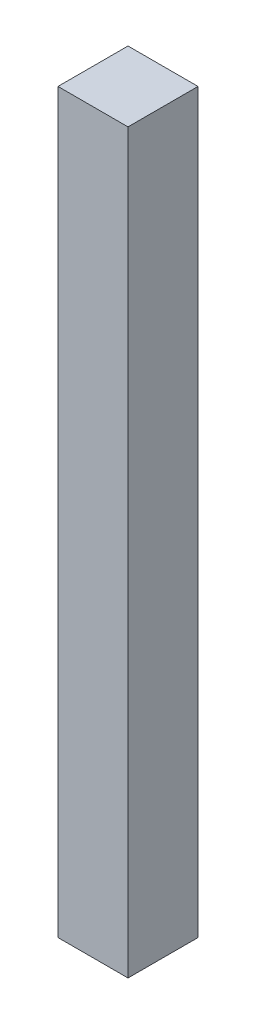
ISO-10303-21;
HEADER;
FILE_DESCRIPTION(('STEP AP214'),'2;1');
FILE_NAME('part.step','',(''),(''),'','','');
FILE_SCHEMA(('AUTOMOTIVE_DESIGN { 1 0 10303 214 1 1 1 1 }'));
ENDSEC;
DATA;
#1=APPLICATION_CONTEXT('core data for automotive mechanical design processes');
#2=APPLICATION_PROTOCOL_DEFINITION('international standard','automotive_design',2000,#1);
#3=PRODUCT_CONTEXT('',#1,'mechanical');
#4=PRODUCT('Part','Part','',(#3));
#5=PRODUCT_RELATED_PRODUCT_CATEGORY('part','',(#4));
#6=PRODUCT_DEFINITION_FORMATION('','',#4);
#7=PRODUCT_DEFINITION_CONTEXT('part definition',#1,'design');
#8=PRODUCT_DEFINITION('design','',#6,#7);
#9=PRODUCT_DEFINITION_SHAPE('','',#8);
#10=(LENGTH_UNIT() NAMED_UNIT(*) SI_UNIT(.MILLI.,.METRE.));
#11=(NAMED_UNIT(*) PLANE_ANGLE_UNIT() SI_UNIT($,.RADIAN.));
#12=(NAMED_UNIT(*) SI_UNIT($,.STERADIAN.) SOLID_ANGLE_UNIT());
#13=UNCERTAINTY_MEASURE_WITH_UNIT(LENGTH_MEASURE(1.E-05),#10,'distance_accuracy_value','');
#14=(GEOMETRIC_REPRESENTATION_CONTEXT(3) GLOBAL_UNCERTAINTY_ASSIGNED_CONTEXT((#13)) GLOBAL_UNIT_ASSIGNED_CONTEXT((#10,
#11,#12)) REPRESENTATION_CONTEXT('',''));
#15=CARTESIAN_POINT('',(0.,0.,0.));
#16=DIRECTION('',(0.,0.,1.));
#17=DIRECTION('',(1.,0.,0.));
#18=AXIS2_PLACEMENT_3D('',#15,#16,#17);
#19=CARTESIAN_POINT('',(-1.68461538461538,60.,-1.89615384615384));
#20=DIRECTION('',(1.,0.,0.));
#21=DIRECTION('',(0.,0.,-1.));
#22=AXIS2_PLACEMENT_3D('',#19,#20,#21);
#23=PLANE('',#22);
#24=DIRECTION('',(0.,0.,1.));
#25=VECTOR('',#24,1.);
#26=CARTESIAN_POINT('',(-1.68461538461538,0.,-1.89615384615384));
#27=LINE('',#26,#25);
#28=CARTESIAN_POINT('',(-1.68461538461538,0.,-1.89615384615384));
#29=VERTEX_POINT('',#28);
#30=CARTESIAN_POINT('',(-1.68461538461537,0.,3.80384615384616));
#31=VERTEX_POINT('',#30);
#32=EDGE_CURVE('E107',#29,#31,#27,.T.);
#33=ORIENTED_EDGE('',*,*,#32,.T.);
#34=DIRECTION('',(0.,-1.,0.));
#35=VECTOR('',#34,1.);
#36=CARTESIAN_POINT('',(-1.68461538461537,60.,3.80384615384616));
#37=LINE('',#36,#35);
#38=CARTESIAN_POINT('',(-1.68461538461537,60.,3.80384615384616));
#39=VERTEX_POINT('',#38);
#40=EDGE_CURVE('E11',#39,#31,#37,.T.);
#41=ORIENTED_EDGE('',*,*,#40,.F.);
#42=DIRECTION('',(0.,0.,1.));
#43=VECTOR('',#42,1.);
#44=CARTESIAN_POINT('',(-1.68461538461538,60.,-1.89615384615384));
#45=LINE('',#44,#43);
#46=CARTESIAN_POINT('',(-1.68461538461538,60.,-1.89615384615384));
#47=VERTEX_POINT('',#46);
#48=EDGE_CURVE('E91',#47,#39,#45,.T.);
#49=ORIENTED_EDGE('',*,*,#48,.F.);
#50=DIRECTION('',(0.,-1.,0.));
#51=VECTOR('',#50,1.);
#52=CARTESIAN_POINT('',(-1.68461538461538,60.,-1.89615384615384));
#53=LINE('',#52,#51);
#54=EDGE_CURVE('E103',#47,#29,#53,.T.);
#55=ORIENTED_EDGE('',*,*,#54,.T.);
#56=EDGE_LOOP('',(#33,#41,#49,#55));
#57=FACE_BOUND('',#56,.T.);
#58=ADVANCED_FACE('F39',(#57),#23,.F.);
#59=CARTESIAN_POINT('',(-1.68461538461537,60.,3.80384615384616));
#60=DIRECTION('',(0.,0.,-1.));
#61=DIRECTION('',(-1.,0.,0.));
#62=AXIS2_PLACEMENT_3D('',#59,#60,#61);
#63=PLANE('',#62);
#64=DIRECTION('',(1.,0.,0.));
#65=VECTOR('',#64,1.);
#66=CARTESIAN_POINT('',(-1.68461538461537,0.,3.80384615384616));
#67=LINE('',#66,#65);
#68=CARTESIAN_POINT('',(4.01538461538463,0.,3.80384615384616));
#69=VERTEX_POINT('',#68);
#70=EDGE_CURVE('E96',#31,#69,#67,.T.);
#71=ORIENTED_EDGE('',*,*,#70,.T.);
#72=DIRECTION('',(0.,-1.,0.));
#73=VECTOR('',#72,1.);
#74=CARTESIAN_POINT('',(4.01538461538463,60.,3.80384615384616));
#75=LINE('',#74,#73);
#76=CARTESIAN_POINT('',(4.01538461538463,60.,3.80384615384616));
#77=VERTEX_POINT('',#76);
#78=EDGE_CURVE('E48',#77,#69,#75,.T.);
#79=ORIENTED_EDGE('',*,*,#78,.F.);
#80=DIRECTION('',(1.,0.,0.));
#81=VECTOR('',#80,1.);
#82=CARTESIAN_POINT('',(-1.68461538461537,60.,3.80384615384616));
#83=LINE('',#82,#81);
#84=EDGE_CURVE('E86',#39,#77,#83,.T.);
#85=ORIENTED_EDGE('',*,*,#84,.F.);
#86=ORIENTED_EDGE('',*,*,#40,.T.);
#87=EDGE_LOOP('',(#71,#79,#85,#86));
#88=FACE_BOUND('',#87,.T.);
#89=ADVANCED_FACE('F95',(#88),#63,.F.);
#90=CARTESIAN_POINT('',(4.01538461538462,60.,-1.89615384615384));
#91=DIRECTION('',(-1.,0.,0.));
#92=DIRECTION('',(0.,0.,1.));
#93=AXIS2_PLACEMENT_3D('',#90,#91,#92);
#94=PLANE('',#93);
#95=DIRECTION('',(0.,0.,-1.));
#96=VECTOR('',#95,1.);
#97=CARTESIAN_POINT('',(4.01538461538462,0.,-1.89615384615384));
#98=LINE('',#97,#96);
#99=CARTESIAN_POINT('',(4.01538461538462,0.,-1.89615384615384));
#100=VERTEX_POINT('',#99);
#101=EDGE_CURVE('E73',#69,#100,#98,.T.);
#102=ORIENTED_EDGE('',*,*,#101,.T.);
#103=DIRECTION('',(0.,-1.,0.));
#104=VECTOR('',#103,1.);
#105=CARTESIAN_POINT('',(4.01538461538462,60.,-1.89615384615384));
#106=LINE('',#105,#104);
#107=CARTESIAN_POINT('',(4.01538461538462,60.,-1.89615384615384));
#108=VERTEX_POINT('',#107);
#109=EDGE_CURVE('E98',#108,#100,#106,.T.);
#110=ORIENTED_EDGE('',*,*,#109,.F.);
#111=DIRECTION('',(0.,0.,-1.));
#112=VECTOR('',#111,1.);
#113=CARTESIAN_POINT('',(4.01538461538462,60.,-1.89615384615384));
#114=LINE('',#113,#112);
#115=EDGE_CURVE('E89',#77,#108,#114,.T.);
#116=ORIENTED_EDGE('',*,*,#115,.F.);
#117=ORIENTED_EDGE('',*,*,#78,.T.);
#118=EDGE_LOOP('',(#102,#110,#116,#117));
#119=FACE_BOUND('',#118,.T.);
#120=ADVANCED_FACE('F99',(#119),#94,.F.);
#121=CARTESIAN_POINT('',(-1.68461538461538,60.,-1.89615384615384));
#122=DIRECTION('',(0.,0.,1.));
#123=DIRECTION('',(1.,0.,0.));
#124=AXIS2_PLACEMENT_3D('',#121,#122,#123);
#125=PLANE('',#124);
#126=DIRECTION('',(-1.,0.,0.));
#127=VECTOR('',#126,1.);
#128=CARTESIAN_POINT('',(-1.68461538461538,0.,-1.89615384615384));
#129=LINE('',#128,#127);
#130=EDGE_CURVE('E79',#100,#29,#129,.T.);
#131=ORIENTED_EDGE('',*,*,#130,.T.);
#132=ORIENTED_EDGE('',*,*,#54,.F.);
#133=DIRECTION('',(-1.,0.,0.));
#134=VECTOR('',#133,1.);
#135=CARTESIAN_POINT('',(-1.68461538461538,60.,-1.89615384615384));
#136=LINE('',#135,#134);
#137=EDGE_CURVE('E56',#108,#47,#136,.T.);
#138=ORIENTED_EDGE('',*,*,#137,.F.);
#139=ORIENTED_EDGE('',*,*,#109,.T.);
#140=EDGE_LOOP('',(#131,#132,#138,#139));
#141=FACE_BOUND('',#140,.T.);
#142=ADVANCED_FACE('F120',(#141),#125,.F.);
#143=CARTESIAN_POINT('',(0.,60.,0.));
#144=DIRECTION('',(0.,1.,0.));
#145=DIRECTION('',(0.,0.,1.));
#146=AXIS2_PLACEMENT_3D('',#143,#144,#145);
#147=PLANE('',#146);
#148=ORIENTED_EDGE('',*,*,#48,.T.);
#149=ORIENTED_EDGE('',*,*,#84,.T.);
#150=ORIENTED_EDGE('',*,*,#115,.T.);
#151=ORIENTED_EDGE('',*,*,#137,.T.);
#152=EDGE_LOOP('',(#148,#149,#150,#151));
#153=FACE_BOUND('',#152,.T.);
#154=ADVANCED_FACE('F87',(#153),#147,.T.);
#155=CARTESIAN_POINT('',(0.,0.,0.));
#156=DIRECTION('',(0.,1.,0.));
#157=DIRECTION('',(0.,0.,1.));
#158=AXIS2_PLACEMENT_3D('',#155,#156,#157);
#159=PLANE('',#158);
#160=ORIENTED_EDGE('',*,*,#32,.F.);
#161=ORIENTED_EDGE('',*,*,#130,.F.);
#162=ORIENTED_EDGE('',*,*,#101,.F.);
#163=ORIENTED_EDGE('',*,*,#70,.F.);
#164=EDGE_LOOP('',(#160,#161,#162,#163));
#165=FACE_BOUND('',#164,.T.);
#166=ADVANCED_FACE('F123',(#165),#159,.F.);
#167=CLOSED_SHELL('',(#58,#89,#120,#142,#154,#166));
#168=MANIFOLD_SOLID_BREP('B2',#167);
#169=ADVANCED_BREP_SHAPE_REPRESENTATION('',(#18,#168),#14);
#170=SHAPE_DEFINITION_REPRESENTATION(#9,#169);
ENDSEC;
END-ISO-10303-21;
